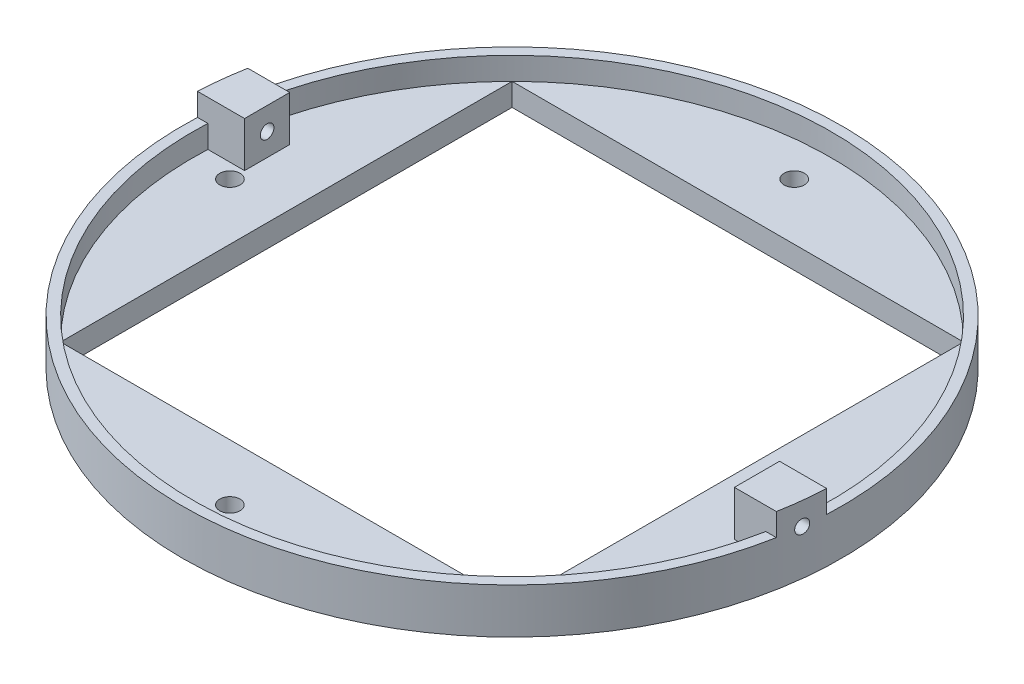
ISO-10303-21;
HEADER;
FILE_DESCRIPTION(('STEP AP214'),'2;1');
FILE_NAME('part.step','',(''),(''),'','','');
FILE_SCHEMA(('AUTOMOTIVE_DESIGN { 1 0 10303 214 1 1 1 1 }'));
ENDSEC;
DATA;
#1=APPLICATION_CONTEXT('core data for automotive mechanical design processes');
#2=APPLICATION_PROTOCOL_DEFINITION('international standard','automotive_design',2000,#1);
#3=PRODUCT_CONTEXT('',#1,'mechanical');
#4=PRODUCT('Part','Part','',(#3));
#5=PRODUCT_RELATED_PRODUCT_CATEGORY('part','',(#4));
#6=PRODUCT_DEFINITION_FORMATION('','',#4);
#7=PRODUCT_DEFINITION_CONTEXT('part definition',#1,'design');
#8=PRODUCT_DEFINITION('design','',#6,#7);
#9=PRODUCT_DEFINITION_SHAPE('','',#8);
#10=(LENGTH_UNIT() NAMED_UNIT(*) SI_UNIT(.MILLI.,.METRE.));
#11=(NAMED_UNIT(*) PLANE_ANGLE_UNIT() SI_UNIT($,.RADIAN.));
#12=(NAMED_UNIT(*) SI_UNIT($,.STERADIAN.) SOLID_ANGLE_UNIT());
#13=UNCERTAINTY_MEASURE_WITH_UNIT(LENGTH_MEASURE(1.E-05),#10,'distance_accuracy_value','');
#14=(GEOMETRIC_REPRESENTATION_CONTEXT(3) GLOBAL_UNCERTAINTY_ASSIGNED_CONTEXT((#13)) GLOBAL_UNIT_ASSIGNED_CONTEXT((#10,
#11,#12)) REPRESENTATION_CONTEXT('',''));
#15=CARTESIAN_POINT('',(0.,0.,0.));
#16=DIRECTION('',(0.,0.,1.));
#17=DIRECTION('',(1.,0.,0.));
#18=AXIS2_PLACEMENT_3D('',#15,#16,#17);
#19=CARTESIAN_POINT('',(0.,10.,0.));
#20=DIRECTION('',(0.,1.,0.));
#21=DIRECTION('',(0.,0.,1.));
#22=AXIS2_PLACEMENT_3D('',#19,#20,#21);
#23=PLANE('',#22);
#24=CARTESIAN_POINT('',(0.,10.,0.));
#25=DIRECTION('',(0.,1.,0.));
#26=DIRECTION('',(0.,0.,1.));
#27=AXIS2_PLACEMENT_3D('',#24,#25,#26);
#28=CIRCLE('',#27,73.);
#29=CARTESIAN_POINT('',(-72.9276182251964,10.,-3.25));
#30=VERTEX_POINT('',#29);
#31=CARTESIAN_POINT('',(71.7874466741923,10.,13.25));
#32=VERTEX_POINT('',#31);
#33=EDGE_CURVE('E260',#30,#32,#28,.T.);
#34=ORIENTED_EDGE('',*,*,#33,.T.);
#35=DIRECTION('',(-1.,0.,0.));
#36=VECTOR('',#35,1.);
#37=CARTESIAN_POINT('',(0.,10.,13.25));
#38=LINE('',#37,#36);
#39=CARTESIAN_POINT('',(69.4581708656368,10.,13.25));
#40=VERTEX_POINT('',#39);
#41=EDGE_CURVE('E200',#32,#40,#38,.T.);
#42=ORIENTED_EDGE('',*,*,#41,.T.);
#43=CARTESIAN_POINT('',(0.,10.,0.));
#44=DIRECTION('',(0.,1.,0.));
#45=DIRECTION('',(0.,0.,1.));
#46=AXIS2_PLACEMENT_3D('',#43,#44,#45);
#47=CIRCLE('',#46,70.7106781186548);
#48=CARTESIAN_POINT('',(-70.6359504784922,10.,-3.25));
#49=VERTEX_POINT('',#48);
#50=EDGE_CURVE('E251',#49,#40,#47,.T.);
#51=ORIENTED_EDGE('',*,*,#50,.F.);
#52=DIRECTION('',(1.,0.,0.));
#53=VECTOR('',#52,1.);
#54=CARTESIAN_POINT('',(0.,10.,-3.25000000000002));
#55=LINE('',#54,#53);
#56=EDGE_CURVE('E241',#30,#49,#55,.T.);
#57=ORIENTED_EDGE('',*,*,#56,.F.);
#58=EDGE_LOOP('',(#34,#42,#51,#57));
#59=FACE_BOUND('',#58,.T.);
#60=ADVANCED_FACE('F60',(#59),#23,.T.);
#61=CARTESIAN_POINT('',(0.,10.,0.));
#62=DIRECTION('',(0.,-1.,0.));
#63=DIRECTION('',(0.,0.,-1.));
#64=AXIS2_PLACEMENT_3D('',#61,#62,#63);
#65=CYLINDRICAL_SURFACE('',#64,70.7106781186548);
#66=ORIENTED_EDGE('',*,*,#50,.T.);
#67=DIRECTION('',(0.,-1.,0.));
#68=VECTOR('',#67,1.);
#69=CARTESIAN_POINT('',(69.4581708656368,10.,13.25));
#70=LINE('',#69,#68);
#71=CARTESIAN_POINT('',(69.4581708656368,5.,13.25));
#72=VERTEX_POINT('',#71);
#73=EDGE_CURVE('E210',#40,#72,#70,.T.);
#74=ORIENTED_EDGE('',*,*,#73,.T.);
#75=CARTESIAN_POINT('',(0.,5.,0.));
#76=DIRECTION('',(0.,1.,0.));
#77=DIRECTION('',(0.,0.,1.));
#78=AXIS2_PLACEMENT_3D('',#75,#76,#77);
#79=CIRCLE('',#78,70.7106781186548);
#80=CARTESIAN_POINT('',(50.,5.,50.));
#81=VERTEX_POINT('',#80);
#82=EDGE_CURVE('E256',#81,#72,#79,.T.);
#83=ORIENTED_EDGE('',*,*,#82,.F.);
#84=CARTESIAN_POINT('',(-50.,5.,50.));
#85=VERTEX_POINT('',#84);
#86=EDGE_CURVE('E259',#85,#81,#79,.T.);
#87=ORIENTED_EDGE('',*,*,#86,.F.);
#88=CARTESIAN_POINT('',(-70.6359504784922,5.,-3.25));
#89=VERTEX_POINT('',#88);
#90=EDGE_CURVE('E323',#89,#85,#79,.T.);
#91=ORIENTED_EDGE('',*,*,#90,.F.);
#92=DIRECTION('',(0.,-1.,0.));
#93=VECTOR('',#92,1.);
#94=CARTESIAN_POINT('',(-70.6359504784922,10.,-3.25));
#95=LINE('',#94,#93);
#96=EDGE_CURVE('E68',#49,#89,#95,.T.);
#97=ORIENTED_EDGE('',*,*,#96,.F.);
#98=EDGE_LOOP('',(#66,#74,#83,#87,#91,#97));
#99=FACE_BOUND('',#98,.T.);
#100=ADVANCED_FACE('F364',(#99),#65,.F.);
#101=CARTESIAN_POINT('',(0.,5.,0.));
#102=DIRECTION('',(0.,1.,0.));
#103=DIRECTION('',(0.,0.,1.));
#104=AXIS2_PLACEMENT_3D('',#101,#102,#103);
#105=PLANE('',#104);
#106=CARTESIAN_POINT('',(62.5,5.,0.));
#107=DIRECTION('',(0.,1.,0.));
#108=DIRECTION('',(0.,0.,1.));
#109=AXIS2_PLACEMENT_3D('',#106,#107,#108);
#110=CIRCLE('',#109,2.25);
#111=CARTESIAN_POINT('',(62.5,5.,2.25));
#112=VERTEX_POINT('',#111);
#113=EDGE_CURVE('E270',#112,#112,#110,.T.);
#114=ORIENTED_EDGE('',*,*,#113,.F.);
#115=EDGE_LOOP('',(#114));
#116=FACE_BOUND('',#115,.T.);
#117=ORIENTED_EDGE('',*,*,#82,.T.);
#118=DIRECTION('',(1.,0.,0.));
#119=VECTOR('',#118,1.);
#120=CARTESIAN_POINT('',(0.,5.,13.25));
#121=LINE('',#120,#119);
#122=CARTESIAN_POINT('',(62.5,5.,13.25));
#123=VERTEX_POINT('',#122);
#124=EDGE_CURVE('E477',#123,#72,#121,.T.);
#125=ORIENTED_EDGE('',*,*,#124,.F.);
#126=DIRECTION('',(0.,0.,1.));
#127=VECTOR('',#126,1.);
#128=CARTESIAN_POINT('',(62.5,5.,0.));
#129=LINE('',#128,#127);
#130=CARTESIAN_POINT('',(62.5,5.,3.25));
#131=VERTEX_POINT('',#130);
#132=EDGE_CURVE('E196',#131,#123,#129,.T.);
#133=ORIENTED_EDGE('',*,*,#132,.F.);
#134=DIRECTION('',(1.,0.,0.));
#135=VECTOR('',#134,1.);
#136=CARTESIAN_POINT('',(0.,5.,3.25));
#137=LINE('',#136,#135);
#138=CARTESIAN_POINT('',(70.6359504784922,5.,3.25));
#139=VERTEX_POINT('',#138);
#140=EDGE_CURVE('E75',#131,#139,#137,.T.);
#141=ORIENTED_EDGE('',*,*,#140,.T.);
#142=CARTESIAN_POINT('',(50.,5.,-50.));
#143=VERTEX_POINT('',#142);
#144=EDGE_CURVE('E250',#139,#143,#79,.T.);
#145=ORIENTED_EDGE('',*,*,#144,.T.);
#146=DIRECTION('',(0.,0.,-1.));
#147=VECTOR('',#146,1.);
#148=CARTESIAN_POINT('',(50.,5.,50.));
#149=LINE('',#148,#147);
#150=EDGE_CURVE('E278',#81,#143,#149,.T.);
#151=ORIENTED_EDGE('',*,*,#150,.F.);
#152=EDGE_LOOP('',(#117,#125,#133,#141,#145,#151));
#153=FACE_BOUND('',#152,.T.);
#154=ADVANCED_FACE('F333',(#116,#153),#105,.T.);
#155=CARTESIAN_POINT('',(-62.5,5.,0.));
#156=DIRECTION('',(0.,1.,0.));
#157=DIRECTION('',(0.,0.,1.));
#158=AXIS2_PLACEMENT_3D('',#155,#156,#157);
#159=CIRCLE('',#158,2.25);
#160=CARTESIAN_POINT('',(-62.5,5.,2.25));
#161=VERTEX_POINT('',#160);
#162=EDGE_CURVE('E263',#161,#161,#159,.T.);
#163=ORIENTED_EDGE('',*,*,#162,.F.);
#164=EDGE_LOOP('',(#163));
#165=FACE_BOUND('',#164,.T.);
#166=CARTESIAN_POINT('',(-50.,5.,-50.));
#167=VERTEX_POINT('',#166);
#168=CARTESIAN_POINT('',(-69.4581708656368,5.,-13.25));
#169=VERTEX_POINT('',#168);
#170=EDGE_CURVE('E322',#167,#169,#79,.T.);
#171=ORIENTED_EDGE('',*,*,#170,.T.);
#172=DIRECTION('',(-1.,0.,0.));
#173=VECTOR('',#172,1.);
#174=CARTESIAN_POINT('',(0.,5.,-13.25));
#175=LINE('',#174,#173);
#176=CARTESIAN_POINT('',(-62.5,5.,-13.25));
#177=VERTEX_POINT('',#176);
#178=EDGE_CURVE('E214',#177,#169,#175,.T.);
#179=ORIENTED_EDGE('',*,*,#178,.F.);
#180=DIRECTION('',(0.,0.,-1.));
#181=VECTOR('',#180,1.);
#182=CARTESIAN_POINT('',(-62.5,5.,0.));
#183=LINE('',#182,#181);
#184=CARTESIAN_POINT('',(-62.5,5.,-3.25));
#185=VERTEX_POINT('',#184);
#186=EDGE_CURVE('E83',#185,#177,#183,.T.);
#187=ORIENTED_EDGE('',*,*,#186,.F.);
#188=DIRECTION('',(-1.,0.,0.));
#189=VECTOR('',#188,1.);
#190=CARTESIAN_POINT('',(0.,5.,-3.25000000000002));
#191=LINE('',#190,#189);
#192=EDGE_CURVE('E228',#185,#89,#191,.T.);
#193=ORIENTED_EDGE('',*,*,#192,.T.);
#194=ORIENTED_EDGE('',*,*,#90,.T.);
#195=DIRECTION('',(0.,0.,-1.));
#196=VECTOR('',#195,1.);
#197=CARTESIAN_POINT('',(-50.,5.,50.));
#198=LINE('',#197,#196);
#199=EDGE_CURVE('E285',#85,#167,#198,.T.);
#200=ORIENTED_EDGE('',*,*,#199,.T.);
#201=EDGE_LOOP('',(#171,#179,#187,#193,#194,#200));
#202=FACE_BOUND('',#201,.T.);
#203=ADVANCED_FACE('F351',(#165,#202),#105,.T.);
#204=DIRECTION('',(-1.,0.,0.));
#205=VECTOR('',#204,1.);
#206=CARTESIAN_POINT('',(0.,10.,3.25));
#207=LINE('',#206,#205);
#208=CARTESIAN_POINT('',(72.9276182251964,10.,3.25));
#209=VERTEX_POINT('',#208);
#210=CARTESIAN_POINT('',(70.6359504784922,10.,3.25));
#211=VERTEX_POINT('',#210);
#212=EDGE_CURVE('E203',#209,#211,#207,.T.);
#213=ORIENTED_EDGE('',*,*,#212,.F.);
#214=CARTESIAN_POINT('',(-71.7874466741923,10.,-13.25));
#215=VERTEX_POINT('',#214);
#216=EDGE_CURVE('E254',#209,#215,#28,.T.);
#217=ORIENTED_EDGE('',*,*,#216,.T.);
#218=DIRECTION('',(1.,0.,0.));
#219=VECTOR('',#218,1.);
#220=CARTESIAN_POINT('',(0.,10.,-13.25));
#221=LINE('',#220,#219);
#222=CARTESIAN_POINT('',(-69.4581708656368,10.,-13.25));
#223=VERTEX_POINT('',#222);
#224=EDGE_CURVE('E244',#215,#223,#221,.T.);
#225=ORIENTED_EDGE('',*,*,#224,.T.);
#226=EDGE_CURVE('E255',#211,#223,#47,.T.);
#227=ORIENTED_EDGE('',*,*,#226,.F.);
#228=EDGE_LOOP('',(#213,#217,#225,#227));
#229=FACE_BOUND('',#228,.T.);
#230=ADVANCED_FACE('F361',(#229),#23,.T.);
#231=DIRECTION('',(0.,-1.,0.));
#232=VECTOR('',#231,1.);
#233=CARTESIAN_POINT('',(70.6359504784922,10.,3.25));
#234=LINE('',#233,#232);
#235=EDGE_CURVE('E201',#211,#139,#234,.T.);
#236=ORIENTED_EDGE('',*,*,#235,.F.);
#237=ORIENTED_EDGE('',*,*,#226,.T.);
#238=DIRECTION('',(0.,-1.,0.));
#239=VECTOR('',#238,1.);
#240=CARTESIAN_POINT('',(-69.4581708656368,10.,-13.25));
#241=LINE('',#240,#239);
#242=EDGE_CURVE('E12',#223,#169,#241,.T.);
#243=ORIENTED_EDGE('',*,*,#242,.T.);
#244=ORIENTED_EDGE('',*,*,#170,.F.);
#245=EDGE_CURVE('E318',#143,#167,#79,.T.);
#246=ORIENTED_EDGE('',*,*,#245,.F.);
#247=ORIENTED_EDGE('',*,*,#144,.F.);
#248=EDGE_LOOP('',(#236,#237,#243,#244,#246,#247));
#249=FACE_BOUND('',#248,.T.);
#250=ADVANCED_FACE('F337',(#249),#65,.F.);
#251=CARTESIAN_POINT('',(0.,0.,0.));
#252=DIRECTION('',(0.,1.,0.));
#253=DIRECTION('',(0.,0.,1.));
#254=AXIS2_PLACEMENT_3D('',#251,#252,#253);
#255=PLANE('',#254);
#256=DIRECTION('',(0.,0.,-1.));
#257=VECTOR('',#256,1.);
#258=CARTESIAN_POINT('',(50.,0.,50.));
#259=LINE('',#258,#257);
#260=CARTESIAN_POINT('',(50.,0.,50.));
#261=VERTEX_POINT('',#260);
#262=CARTESIAN_POINT('',(50.,0.,-50.));
#263=VERTEX_POINT('',#262);
#264=EDGE_CURVE('E291',#261,#263,#259,.T.);
#265=ORIENTED_EDGE('',*,*,#264,.T.);
#266=DIRECTION('',(1.,0.,0.));
#267=VECTOR('',#266,1.);
#268=CARTESIAN_POINT('',(-50.,0.,-50.));
#269=LINE('',#268,#267);
#270=CARTESIAN_POINT('',(-50.,0.,-50.));
#271=VERTEX_POINT('',#270);
#272=EDGE_CURVE('E289',#271,#263,#269,.T.);
#273=ORIENTED_EDGE('',*,*,#272,.F.);
#274=DIRECTION('',(0.,0.,-1.));
#275=VECTOR('',#274,1.);
#276=CARTESIAN_POINT('',(-50.,0.,50.));
#277=LINE('',#276,#275);
#278=CARTESIAN_POINT('',(-50.,0.,50.));
#279=VERTEX_POINT('',#278);
#280=EDGE_CURVE('E279',#279,#271,#277,.T.);
#281=ORIENTED_EDGE('',*,*,#280,.F.);
#282=DIRECTION('',(1.,0.,0.));
#283=VECTOR('',#282,1.);
#284=CARTESIAN_POINT('',(-50.,0.,50.));
#285=LINE('',#284,#283);
#286=EDGE_CURVE('E295',#279,#261,#285,.T.);
#287=ORIENTED_EDGE('',*,*,#286,.T.);
#288=EDGE_LOOP('',(#265,#273,#281,#287));
#289=FACE_BOUND('',#288,.T.);
#290=CARTESIAN_POINT('',(0.,0.,62.5));
#291=DIRECTION('',(0.,1.,0.));
#292=DIRECTION('',(0.,0.,1.));
#293=AXIS2_PLACEMENT_3D('',#290,#291,#292);
#294=CIRCLE('',#293,2.25);
#295=CARTESIAN_POINT('',(0.,0.,64.75));
#296=VERTEX_POINT('',#295);
#297=EDGE_CURVE('E266',#296,#296,#294,.T.);
#298=ORIENTED_EDGE('',*,*,#297,.T.);
#299=EDGE_LOOP('',(#298));
#300=FACE_BOUND('',#299,.T.);
#301=CARTESIAN_POINT('',(62.5,0.,0.));
#302=DIRECTION('',(0.,1.,0.));
#303=DIRECTION('',(0.,0.,1.));
#304=AXIS2_PLACEMENT_3D('',#301,#302,#303);
#305=CIRCLE('',#304,2.25);
#306=CARTESIAN_POINT('',(62.5,0.,2.25));
#307=VERTEX_POINT('',#306);
#308=EDGE_CURVE('E310',#307,#307,#305,.T.);
#309=ORIENTED_EDGE('',*,*,#308,.T.);
#310=EDGE_LOOP('',(#309));
#311=FACE_BOUND('',#310,.T.);
#312=CARTESIAN_POINT('',(0.,0.,-62.5));
#313=DIRECTION('',(0.,1.,0.));
#314=DIRECTION('',(0.,0.,1.));
#315=AXIS2_PLACEMENT_3D('',#312,#313,#314);
#316=CIRCLE('',#315,2.25);
#317=CARTESIAN_POINT('',(0.,0.,-60.25));
#318=VERTEX_POINT('',#317);
#319=EDGE_CURVE('E313',#318,#318,#316,.T.);
#320=ORIENTED_EDGE('',*,*,#319,.T.);
#321=EDGE_LOOP('',(#320));
#322=FACE_BOUND('',#321,.T.);
#323=CARTESIAN_POINT('',(-62.5,0.,0.));
#324=DIRECTION('',(0.,1.,0.));
#325=DIRECTION('',(0.,0.,1.));
#326=AXIS2_PLACEMENT_3D('',#323,#324,#325);
#327=CIRCLE('',#326,2.25);
#328=CARTESIAN_POINT('',(-62.5,0.,2.25));
#329=VERTEX_POINT('',#328);
#330=EDGE_CURVE('E292',#329,#329,#327,.T.);
#331=ORIENTED_EDGE('',*,*,#330,.T.);
#332=EDGE_LOOP('',(#331));
#333=FACE_BOUND('',#332,.T.);
#334=CARTESIAN_POINT('',(0.,0.,0.));
#335=DIRECTION('',(0.,1.,0.));
#336=DIRECTION('',(0.,0.,1.));
#337=AXIS2_PLACEMENT_3D('',#334,#335,#336);
#338=CIRCLE('',#337,73.);
#339=CARTESIAN_POINT('',(0.,0.,73.));
#340=VERTEX_POINT('',#339);
#341=EDGE_CURVE('E247',#340,#340,#338,.T.);
#342=ORIENTED_EDGE('',*,*,#341,.F.);
#343=EDGE_LOOP('',(#342));
#344=FACE_BOUND('',#343,.T.);
#345=ADVANCED_FACE('F62',(#289,#300,#311,#322,#333,#344),#255,.F.);
#346=CARTESIAN_POINT('',(0.,5.,-62.5));
#347=DIRECTION('',(0.,1.,0.));
#348=DIRECTION('',(0.,0.,1.));
#349=AXIS2_PLACEMENT_3D('',#346,#347,#348);
#350=CIRCLE('',#349,2.25);
#351=CARTESIAN_POINT('',(0.,5.,-60.25));
#352=VERTEX_POINT('',#351);
#353=EDGE_CURVE('E267',#352,#352,#350,.T.);
#354=ORIENTED_EDGE('',*,*,#353,.F.);
#355=EDGE_LOOP('',(#354));
#356=FACE_BOUND('',#355,.T.);
#357=DIRECTION('',(1.,0.,0.));
#358=VECTOR('',#357,1.);
#359=CARTESIAN_POINT('',(-50.,5.,-50.));
#360=LINE('',#359,#358);
#361=EDGE_CURVE('E275',#167,#143,#360,.T.);
#362=ORIENTED_EDGE('',*,*,#361,.T.);
#363=ORIENTED_EDGE('',*,*,#245,.T.);
#364=EDGE_LOOP('',(#362,#363));
#365=FACE_BOUND('',#364,.T.);
#366=ADVANCED_FACE('F347',(#356,#365),#105,.T.);
#367=CARTESIAN_POINT('',(0.,5.,62.5));
#368=DIRECTION('',(0.,1.,0.));
#369=DIRECTION('',(0.,0.,1.));
#370=AXIS2_PLACEMENT_3D('',#367,#368,#369);
#371=CIRCLE('',#370,2.25);
#372=CARTESIAN_POINT('',(0.,5.,64.75));
#373=VERTEX_POINT('',#372);
#374=EDGE_CURVE('E262',#373,#373,#371,.T.);
#375=ORIENTED_EDGE('',*,*,#374,.F.);
#376=EDGE_LOOP('',(#375));
#377=FACE_BOUND('',#376,.T.);
#378=DIRECTION('',(1.,0.,0.));
#379=VECTOR('',#378,1.);
#380=CARTESIAN_POINT('',(-50.,5.,50.));
#381=LINE('',#380,#379);
#382=EDGE_CURVE('E282',#85,#81,#381,.T.);
#383=ORIENTED_EDGE('',*,*,#382,.F.);
#384=ORIENTED_EDGE('',*,*,#86,.T.);
#385=EDGE_LOOP('',(#383,#384));
#386=FACE_BOUND('',#385,.T.);
#387=ADVANCED_FACE('F349',(#377,#386),#105,.T.);
#388=CARTESIAN_POINT('',(-50.,5.,-50.));
#389=DIRECTION('',(0.,0.,-1.));
#390=DIRECTION('',(-1.,0.,0.));
#391=AXIS2_PLACEMENT_3D('',#388,#389,#390);
#392=PLANE('',#391);
#393=ORIENTED_EDGE('',*,*,#272,.T.);
#394=DIRECTION('',(0.,-1.,0.));
#395=VECTOR('',#394,1.);
#396=CARTESIAN_POINT('',(50.,5.,-50.));
#397=LINE('',#396,#395);
#398=EDGE_CURVE('E288',#143,#263,#397,.T.);
#399=ORIENTED_EDGE('',*,*,#398,.F.);
#400=ORIENTED_EDGE('',*,*,#361,.F.);
#401=DIRECTION('',(0.,-1.,0.));
#402=VECTOR('',#401,1.);
#403=CARTESIAN_POINT('',(-50.,5.,-50.));
#404=LINE('',#403,#402);
#405=EDGE_CURVE('E300',#167,#271,#404,.T.);
#406=ORIENTED_EDGE('',*,*,#405,.T.);
#407=EDGE_LOOP('',(#393,#399,#400,#406));
#408=FACE_BOUND('',#407,.T.);
#409=ADVANCED_FACE('F345',(#408),#392,.F.);
#410=CARTESIAN_POINT('',(-50.,5.,50.));
#411=DIRECTION('',(-1.,0.,0.));
#412=DIRECTION('',(0.,0.,1.));
#413=AXIS2_PLACEMENT_3D('',#410,#411,#412);
#414=PLANE('',#413);
#415=ORIENTED_EDGE('',*,*,#280,.T.);
#416=ORIENTED_EDGE('',*,*,#405,.F.);
#417=ORIENTED_EDGE('',*,*,#199,.F.);
#418=DIRECTION('',(0.,-1.,0.));
#419=VECTOR('',#418,1.);
#420=CARTESIAN_POINT('',(-50.,5.,50.));
#421=LINE('',#420,#419);
#422=EDGE_CURVE('E302',#85,#279,#421,.T.);
#423=ORIENTED_EDGE('',*,*,#422,.T.);
#424=EDGE_LOOP('',(#415,#416,#417,#423));
#425=FACE_BOUND('',#424,.T.);
#426=ADVANCED_FACE('F390',(#425),#414,.F.);
#427=CARTESIAN_POINT('',(-50.,5.,50.));
#428=DIRECTION('',(0.,0.,-1.));
#429=DIRECTION('',(-1.,0.,0.));
#430=AXIS2_PLACEMENT_3D('',#427,#428,#429);
#431=PLANE('',#430);
#432=ORIENTED_EDGE('',*,*,#286,.F.);
#433=ORIENTED_EDGE('',*,*,#422,.F.);
#434=ORIENTED_EDGE('',*,*,#382,.T.);
#435=DIRECTION('',(0.,-1.,0.));
#436=VECTOR('',#435,1.);
#437=CARTESIAN_POINT('',(50.,5.,50.));
#438=LINE('',#437,#436);
#439=EDGE_CURVE('E304',#81,#261,#438,.T.);
#440=ORIENTED_EDGE('',*,*,#439,.T.);
#441=EDGE_LOOP('',(#432,#433,#434,#440));
#442=FACE_BOUND('',#441,.T.);
#443=ADVANCED_FACE('F395',(#442),#431,.T.);
#444=CARTESIAN_POINT('',(50.,5.,50.));
#445=DIRECTION('',(-1.,0.,0.));
#446=DIRECTION('',(0.,0.,1.));
#447=AXIS2_PLACEMENT_3D('',#444,#445,#446);
#448=PLANE('',#447);
#449=ORIENTED_EDGE('',*,*,#264,.F.);
#450=ORIENTED_EDGE('',*,*,#439,.F.);
#451=ORIENTED_EDGE('',*,*,#150,.T.);
#452=ORIENTED_EDGE('',*,*,#398,.T.);
#453=EDGE_LOOP('',(#449,#450,#451,#452));
#454=FACE_BOUND('',#453,.T.);
#455=ADVANCED_FACE('F342',(#454),#448,.T.);
#456=CARTESIAN_POINT('',(0.,-5.,62.5));
#457=DIRECTION('',(0.,1.,0.));
#458=DIRECTION('',(0.,0.,1.));
#459=AXIS2_PLACEMENT_3D('',#456,#457,#458);
#460=CYLINDRICAL_SURFACE('',#459,2.25);
#461=ORIENTED_EDGE('',*,*,#374,.T.);
#462=EDGE_LOOP('',(#461));
#463=FACE_BOUND('',#462,.T.);
#464=ORIENTED_EDGE('',*,*,#297,.F.);
#465=EDGE_LOOP('',(#464));
#466=FACE_BOUND('',#465,.T.);
#467=ADVANCED_FACE('F602',(#463,#466),#460,.F.);
#468=CARTESIAN_POINT('',(62.5,-5.,0.));
#469=DIRECTION('',(0.,1.,0.));
#470=DIRECTION('',(0.,0.,1.));
#471=AXIS2_PLACEMENT_3D('',#468,#469,#470);
#472=CYLINDRICAL_SURFACE('',#471,2.25);
#473=ORIENTED_EDGE('',*,*,#113,.T.);
#474=EDGE_LOOP('',(#473));
#475=FACE_BOUND('',#474,.T.);
#476=ORIENTED_EDGE('',*,*,#308,.F.);
#477=EDGE_LOOP('',(#476));
#478=FACE_BOUND('',#477,.T.);
#479=ADVANCED_FACE('F652',(#475,#478),#472,.F.);
#480=CARTESIAN_POINT('',(0.,-5.,-62.5));
#481=DIRECTION('',(0.,1.,0.));
#482=DIRECTION('',(0.,0.,1.));
#483=AXIS2_PLACEMENT_3D('',#480,#481,#482);
#484=CYLINDRICAL_SURFACE('',#483,2.25);
#485=ORIENTED_EDGE('',*,*,#353,.T.);
#486=EDGE_LOOP('',(#485));
#487=FACE_BOUND('',#486,.T.);
#488=ORIENTED_EDGE('',*,*,#319,.F.);
#489=EDGE_LOOP('',(#488));
#490=FACE_BOUND('',#489,.T.);
#491=ADVANCED_FACE('F416',(#487,#490),#484,.F.);
#492=CARTESIAN_POINT('',(-62.5,-5.,0.));
#493=DIRECTION('',(0.,1.,0.));
#494=DIRECTION('',(0.,0.,1.));
#495=AXIS2_PLACEMENT_3D('',#492,#493,#494);
#496=CYLINDRICAL_SURFACE('',#495,2.25);
#497=ORIENTED_EDGE('',*,*,#162,.T.);
#498=EDGE_LOOP('',(#497));
#499=FACE_BOUND('',#498,.T.);
#500=ORIENTED_EDGE('',*,*,#330,.F.);
#501=EDGE_LOOP('',(#500));
#502=FACE_BOUND('',#501,.T.);
#503=ADVANCED_FACE('F408',(#499,#502),#496,.F.);
#504=CARTESIAN_POINT('',(0.,10.,0.));
#505=DIRECTION('',(0.,-1.,0.));
#506=DIRECTION('',(0.,0.,-1.));
#507=AXIS2_PLACEMENT_3D('',#504,#505,#506);
#508=CYLINDRICAL_SURFACE('',#507,73.);
#509=CARTESIAN_POINT('',(-72.3459570397683,10.,-9.75));
#510=CARTESIAN_POINT('',(-72.3459576839866,10.0837194979535,-9.74999619649252));
#511=CARTESIAN_POINT('',(-72.3469060225839,10.1674998210345,-9.7429664585056));
#512=CARTESIAN_POINT('',(-72.3506622768941,10.3327415808552,-9.71503262343754));
#513=CARTESIAN_POINT('',(-72.3534724285061,10.4142001064551,-9.69411184418041));
#514=CARTESIAN_POINT('',(-72.360831309766,10.5723692137992,-9.6390279306562));
#515=CARTESIAN_POINT('',(-72.3653788455566,10.6490830139533,-9.60487388950067));
#516=CARTESIAN_POINT('',(-72.3760226823596,10.795650042771,-9.5243363330637));
#517=CARTESIAN_POINT('',(-72.3821186333547,10.8655048169664,-9.47795558152393));
#518=CARTESIAN_POINT('',(-72.3956458310517,10.9967437673068,-9.37407127687351));
#519=CARTESIAN_POINT('',(-72.4030828521277,11.0580891992615,-9.31651953848938));
#520=CARTESIAN_POINT('',(-72.418987844179,11.1702674187536,-9.19206871775231));
#521=CARTESIAN_POINT('',(-72.4274558965542,11.2210993753973,-9.12516889730762));
#522=CARTESIAN_POINT('',(-72.4451860402608,11.3112398337935,-8.98332685614013));
#523=CARTESIAN_POINT('',(-72.4544540446053,11.3504509664607,-8.90832349043259));
#524=CARTESIAN_POINT('',(-72.4734009658881,11.4157178163274,-8.75284413965961));
#525=CARTESIAN_POINT('',(-72.4830798973321,11.4417730687106,-8.67236796134567));
#526=CARTESIAN_POINT('',(-72.5025917086718,11.4801263433152,-8.50770855597138));
#527=CARTESIAN_POINT('',(-72.5124251606248,11.4923420474444,-8.42350621099542));
#528=CARTESIAN_POINT('',(-72.5318898772766,11.5023886710994,-8.25422370605418));
#529=CARTESIAN_POINT('',(-72.5415211400423,11.5002194531517,-8.1691435377075));
#530=CARTESIAN_POINT('',(-72.5603223089031,11.481527805145,-8.00042750574203));
#531=CARTESIAN_POINT('',(-72.569491710082,11.4649900125534,-7.91679328574));
#532=CARTESIAN_POINT('',(-72.5871244974414,11.4179801312537,-7.75345786676126));
#533=CARTESIAN_POINT('',(-72.5955878923884,11.3875082155964,-7.67375661895376));
#534=CARTESIAN_POINT('',(-72.6115890675079,11.3135881327531,-7.52083976771874));
#535=CARTESIAN_POINT('',(-72.6191297767575,11.2701826149739,-7.44760385771624));
#536=CARTESIAN_POINT('',(-72.6331656652516,11.1715672330749,-7.30945102565393));
#537=CARTESIAN_POINT('',(-72.6396608726004,11.1163576863518,-7.24453387998724));
#538=CARTESIAN_POINT('',(-72.6514604065485,10.9960080138712,-7.12522872939868));
#539=CARTESIAN_POINT('',(-72.6567707394472,10.9309209204066,-7.07078782173025));
#540=CARTESIAN_POINT('',(-72.6661625627431,10.792450353963,-6.97360808747957));
#541=CARTESIAN_POINT('',(-72.6702440853808,10.7190670987218,-6.93086895387794));
#542=CARTESIAN_POINT('',(-72.6771079232213,10.5664643580198,-6.85852059218761));
#543=CARTESIAN_POINT('',(-72.679896326038,10.487274294261,-6.82884987586415));
#544=CARTESIAN_POINT('',(-72.6841701957475,10.3250062973274,-6.78320963989066));
#545=CARTESIAN_POINT('',(-72.6856556870726,10.2419284370877,-6.76723986331956));
#546=CARTESIAN_POINT('',(-72.6873055541146,10.0745100096234,-6.74949568781789));
#547=CARTESIAN_POINT('',(-72.6874738735133,9.99017396977269,-6.74767891412988));
#548=CARTESIAN_POINT('',(-72.6864980895324,9.82239498800952,-6.75818187661222));
#549=CARTESIAN_POINT('',(-72.6853539971177,9.73895203864138,-6.77050149467618));
#550=CARTESIAN_POINT('',(-72.6817667191842,9.57539544960857,-6.8089025665746));
#551=CARTESIAN_POINT('',(-72.6793245684793,9.49527921265724,-6.83497305806578));
#552=CARTESIAN_POINT('',(-72.6731691873526,9.3405709498637,-6.90011190600672));
#553=CARTESIAN_POINT('',(-72.6694559534995,9.26597893893488,-6.93918029754451));
#554=CARTESIAN_POINT('',(-72.6607987512784,9.12431334692029,-7.02925080354294));
#555=CARTESIAN_POINT('',(-72.6558529965121,9.0572508855143,-7.08027023316642));
#556=CARTESIAN_POINT('',(-72.6448048497182,8.93264516690478,-7.1927402922445));
#557=CARTESIAN_POINT('',(-72.6387024400345,8.87510205503659,-7.25419108092941));
#558=CARTESIAN_POINT('',(-72.6254183461671,8.77094104777774,-7.38600059155132));
#559=CARTESIAN_POINT('',(-72.6182328849917,8.72436290801446,-7.45639034598732));
#560=CARTESIAN_POINT('',(-72.6029358217602,8.64367616052311,-7.60389382952392));
#561=CARTESIAN_POINT('',(-72.5948241967901,8.60956786139567,-7.68100772497348));
#562=CARTESIAN_POINT('',(-72.5778066462391,8.55460319206205,-7.84017954334164));
#563=CARTESIAN_POINT('',(-72.5688969187923,8.53381456650864,-7.92226045246931));
#564=CARTESIAN_POINT('',(-72.5505349489889,8.50631561916956,-8.08868875026514));
#565=CARTESIAN_POINT('',(-72.5410826891706,8.49960575077798,-8.17303621183705));
#566=CARTESIAN_POINT('',(-72.5218420394653,8.50043212259066,-8.34204384676315));
#567=CARTESIAN_POINT('',(-72.5120522257668,8.50803854877835,-8.42670351934113));
#568=CARTESIAN_POINT('',(-72.4924705950913,8.53741297386514,-8.59353036552765));
#569=CARTESIAN_POINT('',(-72.4826787780746,8.55918128925436,-8.67569748338958));
#570=CARTESIAN_POINT('',(-72.4633847574947,8.6163409926706,-8.83540372699321));
#571=CARTESIAN_POINT('',(-72.4538832758826,8.65176376185446,-8.91293171324564));
#572=CARTESIAN_POINT('',(-72.4355229563918,8.73524741409821,-9.06093714301161));
#573=CARTESIAN_POINT('',(-72.4266640903374,8.78330774263024,-9.13141489569753));
#574=CARTESIAN_POINT('',(-72.4099372422607,8.8905930471575,-9.26312001027838));
#575=CARTESIAN_POINT('',(-72.4020667801118,8.94978910833225,-9.32437060558981));
#576=CARTESIAN_POINT('',(-72.3875950169084,9.07779009139455,-9.43606213753482));
#577=CARTESIAN_POINT('',(-72.3809939877467,9.14659706635619,-9.48650075867437));
#578=CARTESIAN_POINT('',(-72.3693715389729,9.29137183804634,-9.57476047651973));
#579=CARTESIAN_POINT('',(-72.3643401473623,9.36729027168046,-9.6126613234148));
#580=CARTESIAN_POINT('',(-72.3560154592561,9.52444463674994,-9.67512427096312));
#581=CARTESIAN_POINT('',(-72.3527199655661,9.60567369912919,-9.69970323479645));
#582=CARTESIAN_POINT('',(-72.3489002073855,9.73953686876972,-9.72814215409446));
#583=CARTESIAN_POINT('',(-72.3477984906373,9.79127550208069,-9.73632807662235));
#584=CARTESIAN_POINT('',(-72.3463267073319,9.89533483301218,-9.74725817450742));
#585=CARTESIAN_POINT('',(-72.3459566369796,9.9476555276121,-9.75000237809109));
#586=CARTESIAN_POINT('',(-72.3459570397683,10.,-9.75));
#587=B_SPLINE_CURVE_WITH_KNOTS('',3,(#509,#510,#511,#512,#513,#514,#515,#516,#517,#518,#519,
#520,#521,#522,#523,#524,#525,#526,#527,#528,#529,#530,#531,#532,#533,#534,#535,#536,#537,#538,
#539,#540,#541,#542,#543,#544,#545,#546,#547,#548,#549,#550,#551,#552,#553,#554,#555,#556,#557,
#558,#559,#560,#561,#562,#563,#564,#565,#566,#567,#568,#569,#570,#571,#572,#573,#574,#575,#576,
#577,#578,#579,#580,#581,#582,#583,#584,#585,#586),.UNSPECIFIED.,.T.,.F.,(4,2,2,2,2,2,2,2,2,2,2,
2,2,2,2,2,2,2,2,2,2,2,2,2,2,2,2,2,2,2,2,2,2,2,2,2,2,2,4),(0.,0.250966477528476,
0.502234894814077,0.7533309606953,1.00437031708807,1.25651759440636,1.50868479164997,
1.76290871413129,2.01714161808744,2.27287889665005,2.52861861923872,2.78463210950381,
3.04064242037024,3.2958176910199,3.55098610116474,3.80483005467461,4.05866734744391,
4.31129720763077,4.5639223303796,4.8157907898097,5.06765714495054,5.31932301235065,
5.57098955913211,5.82302301114652,6.07506031069157,6.32799781078886,6.58094157009936,
6.83516181291688,7.08939024254992,7.3448682807262,7.60035202852591,7.85642647311536,
8.11248968319985,8.36789695957669,8.6233588794879,8.87716313052624,9.13064535485241,
9.28755953035212,9.44447289192738),.UNSPECIFIED.);
#588=CARTESIAN_POINT('',(-72.3459570397683,10.,-9.75));
#589=VERTEX_POINT('',#588);
#590=EDGE_CURVE('E432',#589,#589,#587,.T.);
#591=ORIENTED_EDGE('',*,*,#590,.T.);
#592=EDGE_LOOP('',(#591));
#593=FACE_BOUND('',#592,.T.);
#594=CARTESIAN_POINT('',(72.3459570397683,10.,9.74999999999999));
#595=CARTESIAN_POINT('',(72.3459576839866,10.0837194979535,9.74999619649252));
#596=CARTESIAN_POINT('',(72.3469060225839,10.1674998210345,9.74296645850559));
#597=CARTESIAN_POINT('',(72.3506622768941,10.3327415808552,9.71503262343754));
#598=CARTESIAN_POINT('',(72.3534724285061,10.4142001064551,9.6941118441804));
#599=CARTESIAN_POINT('',(72.360831309766,10.5723692137992,9.63902793065619));
#600=CARTESIAN_POINT('',(72.3653788455566,10.6490830139533,9.60487388950066));
#601=CARTESIAN_POINT('',(72.3760226823596,10.795650042771,9.52433633306369));
#602=CARTESIAN_POINT('',(72.3821186333547,10.8655048169664,9.47795558152392));
#603=CARTESIAN_POINT('',(72.3956458310517,10.9967437673068,9.3740712768735));
#604=CARTESIAN_POINT('',(72.4030828521277,11.0580891992615,9.31651953848937));
#605=CARTESIAN_POINT('',(72.418987844179,11.1702674187536,9.1920687177523));
#606=CARTESIAN_POINT('',(72.4274558965542,11.2210993753973,9.12516889730761));
#607=CARTESIAN_POINT('',(72.4451860402608,11.3112398337935,8.98332685614013));
#608=CARTESIAN_POINT('',(72.4544540446053,11.3504509664607,8.90832349043258));
#609=CARTESIAN_POINT('',(72.4734009658881,11.4157178163274,8.7528441396596));
#610=CARTESIAN_POINT('',(72.4830798973321,11.4417730687106,8.67236796134566));
#611=CARTESIAN_POINT('',(72.5025917086718,11.4801263433152,8.50770855597137));
#612=CARTESIAN_POINT('',(72.5124251606248,11.4923420474444,8.42350621099542));
#613=CARTESIAN_POINT('',(72.5318898772766,11.5023886710994,8.25422370605417));
#614=CARTESIAN_POINT('',(72.5415211400423,11.5002194531517,8.16914353770749));
#615=CARTESIAN_POINT('',(72.5603223089031,11.481527805145,8.00042750574202));
#616=CARTESIAN_POINT('',(72.569491710082,11.4649900125534,7.91679328573999));
#617=CARTESIAN_POINT('',(72.5871244974414,11.4179801312537,7.75345786676126));
#618=CARTESIAN_POINT('',(72.5955878923884,11.3875082155964,7.67375661895376));
#619=CARTESIAN_POINT('',(72.6115890675079,11.3135881327531,7.52083976771873));
#620=CARTESIAN_POINT('',(72.6191297767575,11.2701826149739,7.44760385771623));
#621=CARTESIAN_POINT('',(72.6331656652517,11.1715672330749,7.30945102565393));
#622=CARTESIAN_POINT('',(72.6396608726004,11.1163576863518,7.24453387998723));
#623=CARTESIAN_POINT('',(72.6514604065485,10.9960080138712,7.12522872939867));
#624=CARTESIAN_POINT('',(72.6567707394472,10.9309209204066,7.07078782173024));
#625=CARTESIAN_POINT('',(72.6661625627431,10.792450353963,6.97360808747956));
#626=CARTESIAN_POINT('',(72.6702440853808,10.7190670987218,6.93086895387793));
#627=CARTESIAN_POINT('',(72.6771079232213,10.5664643580198,6.85852059218761));
#628=CARTESIAN_POINT('',(72.679896326038,10.487274294261,6.82884987586415));
#629=CARTESIAN_POINT('',(72.6841701957475,10.3250062973274,6.78320963989066));
#630=CARTESIAN_POINT('',(72.6856556870726,10.2419284370877,6.76723986331955));
#631=CARTESIAN_POINT('',(72.6873055541146,10.0745100096234,6.74949568781788));
#632=CARTESIAN_POINT('',(72.6874738735133,9.99017396977269,6.74767891412988));
#633=CARTESIAN_POINT('',(72.6864980895324,9.82239498800952,6.75818187661222));
#634=CARTESIAN_POINT('',(72.6853539971177,9.73895203864138,6.77050149467617));
#635=CARTESIAN_POINT('',(72.6817667191842,9.57539544960857,6.8089025665746));
#636=CARTESIAN_POINT('',(72.6793245684793,9.49527921265724,6.83497305806577));
#637=CARTESIAN_POINT('',(72.6731691873526,9.3405709498637,6.90011190600671));
#638=CARTESIAN_POINT('',(72.6694559534995,9.26597893893488,6.9391802975445));
#639=CARTESIAN_POINT('',(72.6607987512784,9.12431334692029,7.02925080354293));
#640=CARTESIAN_POINT('',(72.6558529965121,9.0572508855143,7.08027023316641));
#641=CARTESIAN_POINT('',(72.6448048497182,8.93264516690478,7.19274029224449));
#642=CARTESIAN_POINT('',(72.6387024400345,8.87510205503659,7.2541910809294));
#643=CARTESIAN_POINT('',(72.6254183461671,8.77094104777774,7.38600059155131));
#644=CARTESIAN_POINT('',(72.6182328849917,8.72436290801446,7.45639034598731));
#645=CARTESIAN_POINT('',(72.6029358217602,8.64367616052311,7.60389382952391));
#646=CARTESIAN_POINT('',(72.5948241967901,8.60956786139567,7.68100772497347));
#647=CARTESIAN_POINT('',(72.5778066462391,8.55460319206205,7.84017954334163));
#648=CARTESIAN_POINT('',(72.5688969187923,8.53381456650864,7.9222604524693));
#649=CARTESIAN_POINT('',(72.5505349489889,8.50631561916956,8.08868875026513));
#650=CARTESIAN_POINT('',(72.5410826891706,8.49960575077798,8.17303621183704));
#651=CARTESIAN_POINT('',(72.5218420394653,8.50043212259066,8.34204384676314));
#652=CARTESIAN_POINT('',(72.5120522257668,8.50803854877835,8.42670351934112));
#653=CARTESIAN_POINT('',(72.4924705950913,8.53741297386514,8.59353036552764));
#654=CARTESIAN_POINT('',(72.4826787780746,8.55918128925436,8.67569748338957));
#655=CARTESIAN_POINT('',(72.4633847574947,8.6163409926706,8.83540372699321));
#656=CARTESIAN_POINT('',(72.4538832758826,8.65176376185446,8.91293171324563));
#657=CARTESIAN_POINT('',(72.4355229563919,8.73524741409821,9.0609371430116));
#658=CARTESIAN_POINT('',(72.4266640903374,8.78330774263024,9.13141489569752));
#659=CARTESIAN_POINT('',(72.4099372422607,8.8905930471575,9.26312001027837));
#660=CARTESIAN_POINT('',(72.4020667801118,8.94978910833225,9.3243706055898));
#661=CARTESIAN_POINT('',(72.3875950169084,9.07779009139455,9.43606213753481));
#662=CARTESIAN_POINT('',(72.3809939877467,9.14659706635619,9.48650075867436));
#663=CARTESIAN_POINT('',(72.3693715389729,9.29137183804634,9.57476047651972));
#664=CARTESIAN_POINT('',(72.3643401473623,9.36729027168046,9.61266132341479));
#665=CARTESIAN_POINT('',(72.3560154592561,9.52444463674994,9.67512427096312));
#666=CARTESIAN_POINT('',(72.3527199655661,9.60567369912919,9.69970323479644));
#667=CARTESIAN_POINT('',(72.3489002073855,9.73953686876972,9.72814215409445));
#668=CARTESIAN_POINT('',(72.3477984906373,9.79127550208069,9.73632807662234));
#669=CARTESIAN_POINT('',(72.3463267073319,9.89533483301218,9.74725817450741));
#670=CARTESIAN_POINT('',(72.3459566369796,9.9476555276121,9.75000237809109));
#671=CARTESIAN_POINT('',(72.3459570397683,10.,9.74999999999999));
#672=B_SPLINE_CURVE_WITH_KNOTS('',3,(#594,#595,#596,#597,#598,#599,#600,#601,#602,#603,#604,
#605,#606,#607,#608,#609,#610,#611,#612,#613,#614,#615,#616,#617,#618,#619,#620,#621,#622,#623,
#624,#625,#626,#627,#628,#629,#630,#631,#632,#633,#634,#635,#636,#637,#638,#639,#640,#641,#642,
#643,#644,#645,#646,#647,#648,#649,#650,#651,#652,#653,#654,#655,#656,#657,#658,#659,#660,#661,
#662,#663,#664,#665,#666,#667,#668,#669,#670,#671),.UNSPECIFIED.,.T.,.F.,(4,2,2,2,2,2,2,2,2,2,2,
2,2,2,2,2,2,2,2,2,2,2,2,2,2,2,2,2,2,2,2,2,2,2,2,2,2,2,4),(0.,0.250966477528476,
0.502234894814077,0.7533309606953,1.00437031708807,1.25651759440636,1.50868479164997,
1.76290871413129,2.01714161808744,2.27287889665005,2.52861861923872,2.78463210950381,
3.04064242037024,3.2958176910199,3.55098610116474,3.80483005467461,4.0586673474439,
4.31129720763077,4.56392233037961,4.8157907898097,5.06765714495054,5.31932301235065,
5.57098955913211,5.82302301114652,6.07506031069157,6.32799781078886,6.58094157009937,
6.83516181291689,7.08939024254992,7.3448682807262,7.60035202852591,7.85642647311536,
8.11248968319985,8.36789695957668,8.6233588794879,8.87716313052624,9.1306453548524,
9.28755953035212,9.44447289192738),.UNSPECIFIED.);
#673=CARTESIAN_POINT('',(72.3459570397683,10.,9.74999999999999));
#674=VERTEX_POINT('',#673);
#675=EDGE_CURVE('E425',#674,#674,#672,.T.);
#676=ORIENTED_EDGE('',*,*,#675,.T.);
#677=EDGE_LOOP('',(#676));
#678=FACE_BOUND('',#677,.T.);
#679=ORIENTED_EDGE('',*,*,#216,.F.);
#680=DIRECTION('',(0.,-1.,0.));
#681=VECTOR('',#680,1.);
#682=CARTESIAN_POINT('',(72.9276182251964,15.,3.25));
#683=LINE('',#682,#681);
#684=CARTESIAN_POINT('',(72.9276182251964,15.,3.25));
#685=VERTEX_POINT('',#684);
#686=EDGE_CURVE('E182',#685,#209,#683,.T.);
#687=ORIENTED_EDGE('',*,*,#686,.F.);
#688=CARTESIAN_POINT('',(0.,15.,0.));
#689=DIRECTION('',(0.,1.,0.));
#690=DIRECTION('',(0.,0.,1.));
#691=AXIS2_PLACEMENT_3D('',#688,#689,#690);
#692=CIRCLE('',#691,73.);
#693=CARTESIAN_POINT('',(71.7874466741923,15.,13.25));
#694=VERTEX_POINT('',#693);
#695=EDGE_CURVE('E173',#694,#685,#692,.T.);
#696=ORIENTED_EDGE('',*,*,#695,.F.);
#697=DIRECTION('',(0.,-1.,0.));
#698=VECTOR('',#697,1.);
#699=CARTESIAN_POINT('',(71.7874466741923,15.,13.25));
#700=LINE('',#699,#698);
#701=EDGE_CURVE('E180',#694,#32,#700,.T.);
#702=ORIENTED_EDGE('',*,*,#701,.T.);
#703=ORIENTED_EDGE('',*,*,#33,.F.);
#704=DIRECTION('',(0.,-1.,0.));
#705=VECTOR('',#704,1.);
#706=CARTESIAN_POINT('',(-72.9276182251964,15.,-3.25));
#707=LINE('',#706,#705);
#708=CARTESIAN_POINT('',(-72.9276182251964,15.,-3.25));
#709=VERTEX_POINT('',#708);
#710=EDGE_CURVE('E235',#709,#30,#707,.T.);
#711=ORIENTED_EDGE('',*,*,#710,.F.);
#712=CARTESIAN_POINT('',(0.,15.,0.));
#713=DIRECTION('',(0.,1.,0.));
#714=DIRECTION('',(0.,0.,1.));
#715=AXIS2_PLACEMENT_3D('',#712,#713,#714);
#716=CIRCLE('',#715,73.);
#717=CARTESIAN_POINT('',(-71.7874466741923,15.,-13.25));
#718=VERTEX_POINT('',#717);
#719=EDGE_CURVE('E218',#718,#709,#716,.T.);
#720=ORIENTED_EDGE('',*,*,#719,.F.);
#721=DIRECTION('',(0.,-1.,0.));
#722=VECTOR('',#721,1.);
#723=CARTESIAN_POINT('',(-71.7874466741923,15.,-13.25));
#724=LINE('',#723,#722);
#725=EDGE_CURVE('E238',#718,#215,#724,.T.);
#726=ORIENTED_EDGE('',*,*,#725,.T.);
#727=EDGE_LOOP('',(#679,#687,#696,#702,#703,#711,#720,#726));
#728=FACE_BOUND('',#727,.T.);
#729=ORIENTED_EDGE('',*,*,#341,.T.);
#730=EDGE_LOOP('',(#729));
#731=FACE_BOUND('',#730,.T.);
#732=ADVANCED_FACE('F176',(#593,#678,#728,#731),#508,.T.);
#733=CARTESIAN_POINT('',(0.,15.,-13.25));
#734=DIRECTION('',(0.,0.,1.));
#735=DIRECTION('',(1.,0.,0.));
#736=AXIS2_PLACEMENT_3D('',#733,#734,#735);
#737=PLANE('',#736);
#738=ORIENTED_EDGE('',*,*,#224,.F.);
#739=ORIENTED_EDGE('',*,*,#725,.F.);
#740=DIRECTION('',(-1.,0.,0.));
#741=VECTOR('',#740,1.);
#742=CARTESIAN_POINT('',(0.,15.,-13.25));
#743=LINE('',#742,#741);
#744=CARTESIAN_POINT('',(-62.5,15.,-13.25));
#745=VERTEX_POINT('',#744);
#746=EDGE_CURVE('E215',#745,#718,#743,.T.);
#747=ORIENTED_EDGE('',*,*,#746,.F.);
#748=DIRECTION('',(0.,-1.,0.));
#749=VECTOR('',#748,1.);
#750=CARTESIAN_POINT('',(-62.5,15.,-13.25));
#751=LINE('',#750,#749);
#752=EDGE_CURVE('E225',#745,#177,#751,.T.);
#753=ORIENTED_EDGE('',*,*,#752,.T.);
#754=ORIENTED_EDGE('',*,*,#178,.T.);
#755=ORIENTED_EDGE('',*,*,#242,.F.);
#756=EDGE_LOOP('',(#738,#739,#747,#753,#754,#755));
#757=FACE_BOUND('',#756,.T.);
#758=ADVANCED_FACE('F385',(#757),#737,.F.);
#759=CARTESIAN_POINT('',(0.,15.,-3.25000000000002));
#760=DIRECTION('',(0.,0.,1.));
#761=DIRECTION('',(1.,0.,0.));
#762=AXIS2_PLACEMENT_3D('',#759,#760,#761);
#763=PLANE('',#762);
#764=ORIENTED_EDGE('',*,*,#710,.T.);
#765=ORIENTED_EDGE('',*,*,#56,.T.);
#766=ORIENTED_EDGE('',*,*,#96,.T.);
#767=ORIENTED_EDGE('',*,*,#192,.F.);
#768=DIRECTION('',(0.,-1.,0.));
#769=VECTOR('',#768,1.);
#770=CARTESIAN_POINT('',(-62.5,15.,-3.25));
#771=LINE('',#770,#769);
#772=CARTESIAN_POINT('',(-62.5,15.,-3.25));
#773=VERTEX_POINT('',#772);
#774=EDGE_CURVE('E233',#773,#185,#771,.T.);
#775=ORIENTED_EDGE('',*,*,#774,.F.);
#776=DIRECTION('',(-1.,0.,0.));
#777=VECTOR('',#776,1.);
#778=CARTESIAN_POINT('',(0.,15.,-3.25000000000002));
#779=LINE('',#778,#777);
#780=EDGE_CURVE('E220',#773,#709,#779,.T.);
#781=ORIENTED_EDGE('',*,*,#780,.T.);
#782=EDGE_LOOP('',(#764,#765,#766,#767,#775,#781));
#783=FACE_BOUND('',#782,.T.);
#784=ADVANCED_FACE('F414',(#783),#763,.T.);
#785=CARTESIAN_POINT('',(-62.5,15.,0.));
#786=DIRECTION('',(-1.,0.,0.));
#787=DIRECTION('',(0.,0.,1.));
#788=AXIS2_PLACEMENT_3D('',#785,#786,#787);
#789=PLANE('',#788);
#790=CARTESIAN_POINT('',(-62.5,10.,-8.25));
#791=DIRECTION('',(1.,0.,0.));
#792=DIRECTION('',(0.,0.,-1.));
#793=AXIS2_PLACEMENT_3D('',#790,#791,#792);
#794=CIRCLE('',#793,1.5);
#795=CARTESIAN_POINT('',(-62.5,10.,-9.75));
#796=VERTEX_POINT('',#795);
#797=EDGE_CURVE('E439',#796,#796,#794,.T.);
#798=ORIENTED_EDGE('',*,*,#797,.F.);
#799=EDGE_LOOP('',(#798));
#800=FACE_BOUND('',#799,.T.);
#801=ORIENTED_EDGE('',*,*,#186,.T.);
#802=ORIENTED_EDGE('',*,*,#752,.F.);
#803=DIRECTION('',(0.,0.,-1.));
#804=VECTOR('',#803,1.);
#805=CARTESIAN_POINT('',(-62.5,15.,0.));
#806=LINE('',#805,#804);
#807=EDGE_CURVE('E223',#773,#745,#806,.T.);
#808=ORIENTED_EDGE('',*,*,#807,.F.);
#809=ORIENTED_EDGE('',*,*,#774,.T.);
#810=EDGE_LOOP('',(#801,#802,#808,#809));
#811=FACE_BOUND('',#810,.T.);
#812=ADVANCED_FACE('F463',(#800,#811),#789,.F.);
#813=CARTESIAN_POINT('',(0.,15.,0.));
#814=DIRECTION('',(0.,1.,0.));
#815=DIRECTION('',(0.,0.,1.));
#816=AXIS2_PLACEMENT_3D('',#813,#814,#815);
#817=PLANE('',#816);
#818=ORIENTED_EDGE('',*,*,#746,.T.);
#819=ORIENTED_EDGE('',*,*,#719,.T.);
#820=ORIENTED_EDGE('',*,*,#780,.F.);
#821=ORIENTED_EDGE('',*,*,#807,.T.);
#822=EDGE_LOOP('',(#818,#819,#820,#821));
#823=FACE_BOUND('',#822,.T.);
#824=ADVANCED_FACE('F460',(#823),#817,.T.);
#825=CARTESIAN_POINT('',(0.,15.,13.25));
#826=DIRECTION('',(0.,0.,-1.));
#827=DIRECTION('',(-1.,0.,0.));
#828=AXIS2_PLACEMENT_3D('',#825,#826,#827);
#829=PLANE('',#828);
#830=ORIENTED_EDGE('',*,*,#41,.F.);
#831=ORIENTED_EDGE('',*,*,#701,.F.);
#832=DIRECTION('',(1.,0.,0.));
#833=VECTOR('',#832,1.);
#834=CARTESIAN_POINT('',(0.,15.,13.25));
#835=LINE('',#834,#833);
#836=CARTESIAN_POINT('',(62.5,15.,13.25));
#837=VERTEX_POINT('',#836);
#838=EDGE_CURVE('E187',#837,#694,#835,.T.);
#839=ORIENTED_EDGE('',*,*,#838,.F.);
#840=DIRECTION('',(0.,-1.,0.));
#841=VECTOR('',#840,1.);
#842=CARTESIAN_POINT('',(62.5,15.,13.25));
#843=LINE('',#842,#841);
#844=EDGE_CURVE('E485',#837,#123,#843,.T.);
#845=ORIENTED_EDGE('',*,*,#844,.T.);
#846=ORIENTED_EDGE('',*,*,#124,.T.);
#847=ORIENTED_EDGE('',*,*,#73,.F.);
#848=EDGE_LOOP('',(#830,#831,#839,#845,#846,#847));
#849=FACE_BOUND('',#848,.T.);
#850=ADVANCED_FACE('F198',(#849),#829,.F.);
#851=CARTESIAN_POINT('',(0.,15.,3.25));
#852=DIRECTION('',(0.,0.,-1.));
#853=DIRECTION('',(-1.,0.,0.));
#854=AXIS2_PLACEMENT_3D('',#851,#852,#853);
#855=PLANE('',#854);
#856=ORIENTED_EDGE('',*,*,#686,.T.);
#857=ORIENTED_EDGE('',*,*,#212,.T.);
#858=ORIENTED_EDGE('',*,*,#235,.T.);
#859=ORIENTED_EDGE('',*,*,#140,.F.);
#860=DIRECTION('',(0.,-1.,0.));
#861=VECTOR('',#860,1.);
#862=CARTESIAN_POINT('',(62.5,15.,3.25));
#863=LINE('',#862,#861);
#864=CARTESIAN_POINT('',(62.5,15.,3.25));
#865=VERTEX_POINT('',#864);
#866=EDGE_CURVE('E205',#865,#131,#863,.T.);
#867=ORIENTED_EDGE('',*,*,#866,.F.);
#868=DIRECTION('',(1.,0.,0.));
#869=VECTOR('',#868,1.);
#870=CARTESIAN_POINT('',(0.,15.,3.25));
#871=LINE('',#870,#869);
#872=EDGE_CURVE('E186',#865,#685,#871,.T.);
#873=ORIENTED_EDGE('',*,*,#872,.T.);
#874=EDGE_LOOP('',(#856,#857,#858,#859,#867,#873));
#875=FACE_BOUND('',#874,.T.);
#876=ADVANCED_FACE('F454',(#875),#855,.T.);
#877=CARTESIAN_POINT('',(62.5,15.,0.));
#878=DIRECTION('',(1.,0.,0.));
#879=DIRECTION('',(0.,0.,-1.));
#880=AXIS2_PLACEMENT_3D('',#877,#878,#879);
#881=PLANE('',#880);
#882=CARTESIAN_POINT('',(62.5,10.,8.24999999999999));
#883=DIRECTION('',(-1.,0.,0.));
#884=DIRECTION('',(0.,0.,1.));
#885=AXIS2_PLACEMENT_3D('',#882,#883,#884);
#886=CIRCLE('',#885,1.5);
#887=CARTESIAN_POINT('',(62.5,10.,9.74999999999999));
#888=VERTEX_POINT('',#887);
#889=EDGE_CURVE('E438',#888,#888,#886,.T.);
#890=ORIENTED_EDGE('',*,*,#889,.F.);
#891=EDGE_LOOP('',(#890));
#892=FACE_BOUND('',#891,.T.);
#893=ORIENTED_EDGE('',*,*,#132,.T.);
#894=ORIENTED_EDGE('',*,*,#844,.F.);
#895=DIRECTION('',(0.,0.,1.));
#896=VECTOR('',#895,1.);
#897=CARTESIAN_POINT('',(62.5,15.,0.));
#898=LINE('',#897,#896);
#899=EDGE_CURVE('E192',#865,#837,#898,.T.);
#900=ORIENTED_EDGE('',*,*,#899,.F.);
#901=ORIENTED_EDGE('',*,*,#866,.T.);
#902=EDGE_LOOP('',(#893,#894,#900,#901));
#903=FACE_BOUND('',#902,.T.);
#904=ADVANCED_FACE('F451',(#892,#903),#881,.F.);
#905=CARTESIAN_POINT('',(0.,15.,0.));
#906=DIRECTION('',(0.,1.,0.));
#907=DIRECTION('',(0.,0.,1.));
#908=AXIS2_PLACEMENT_3D('',#905,#906,#907);
#909=PLANE('',#908);
#910=ORIENTED_EDGE('',*,*,#838,.T.);
#911=ORIENTED_EDGE('',*,*,#695,.T.);
#912=ORIENTED_EDGE('',*,*,#872,.F.);
#913=ORIENTED_EDGE('',*,*,#899,.T.);
#914=EDGE_LOOP('',(#910,#911,#912,#913));
#915=FACE_BOUND('',#914,.T.);
#916=ADVANCED_FACE('F190',(#915),#909,.T.);
#917=CARTESIAN_POINT('',(85.5,10.,8.24999999999999));
#918=DIRECTION('',(-1.,0.,0.));
#919=DIRECTION('',(0.,0.,1.));
#920=AXIS2_PLACEMENT_3D('',#917,#918,#919);
#921=CYLINDRICAL_SURFACE('',#920,1.5);
#922=ORIENTED_EDGE('',*,*,#889,.T.);
#923=EDGE_LOOP('',(#922));
#924=FACE_BOUND('',#923,.T.);
#925=ORIENTED_EDGE('',*,*,#675,.F.);
#926=EDGE_LOOP('',(#925));
#927=FACE_BOUND('',#926,.T.);
#928=ADVANCED_FACE('F443',(#924,#927),#921,.F.);
#929=CARTESIAN_POINT('',(-83.5,10.,-8.25));
#930=DIRECTION('',(1.,0.,0.));
#931=DIRECTION('',(0.,0.,-1.));
#932=AXIS2_PLACEMENT_3D('',#929,#930,#931);
#933=CYLINDRICAL_SURFACE('',#932,1.5);
#934=ORIENTED_EDGE('',*,*,#797,.T.);
#935=EDGE_LOOP('',(#934));
#936=FACE_BOUND('',#935,.T.);
#937=ORIENTED_EDGE('',*,*,#590,.F.);
#938=EDGE_LOOP('',(#937));
#939=FACE_BOUND('',#938,.T.);
#940=ADVANCED_FACE('F440',(#936,#939),#933,.F.);
#941=CLOSED_SHELL('',(#60,#100,#154,#203,#230,#250,#345,#366,#387,#409,#426,#443,#455,#467,#479,
#491,#503,#732,#758,#784,#812,#824,#850,#876,#904,#916,#928,#940));
#942=MANIFOLD_SOLID_BREP('B2',#941);
#943=ADVANCED_BREP_SHAPE_REPRESENTATION('',(#18,#942),#14);
#944=SHAPE_DEFINITION_REPRESENTATION(#9,#943);
ENDSEC;
END-ISO-10303-21;
